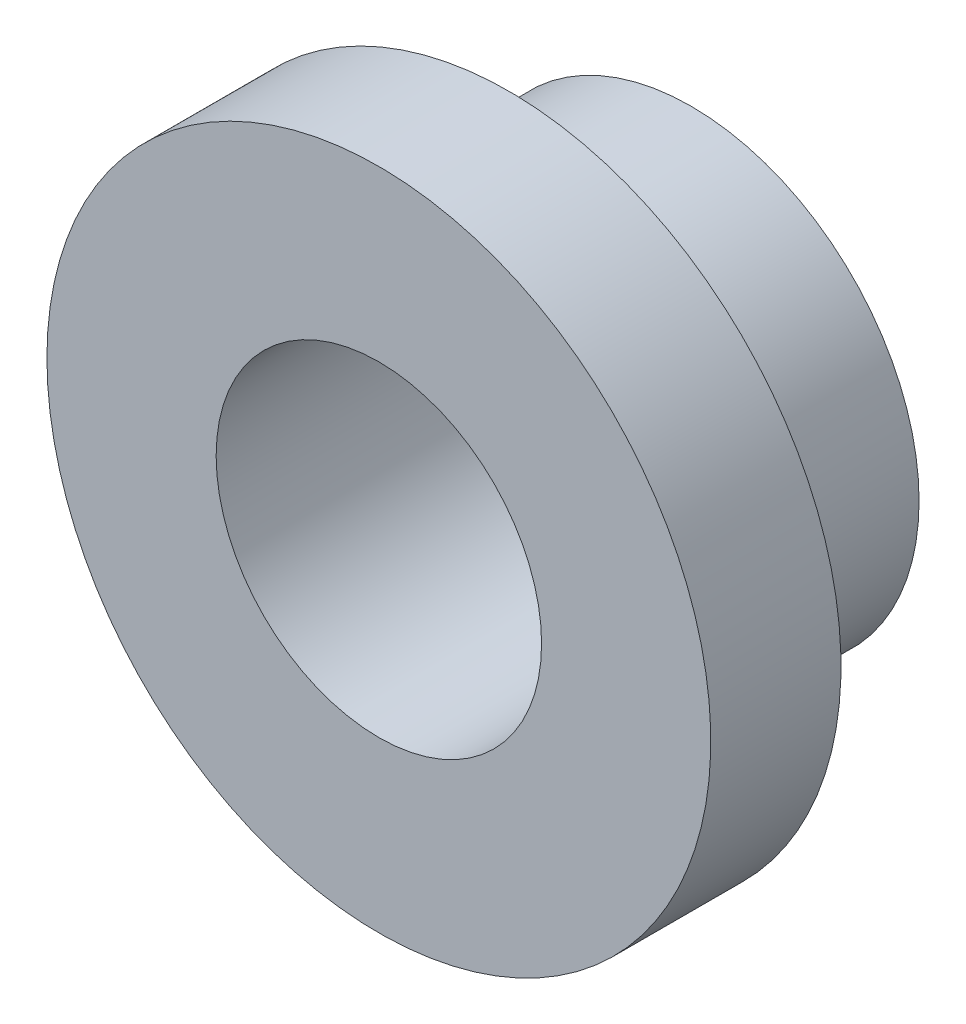
ISO-10303-21;
HEADER;
FILE_DESCRIPTION(('STEP AP214'),'2;1');
FILE_NAME('part.step','',(''),(''),'','','');
FILE_SCHEMA(('AUTOMOTIVE_DESIGN { 1 0 10303 214 1 1 1 1 }'));
ENDSEC;
DATA;
#1=APPLICATION_CONTEXT('core data for automotive mechanical design processes');
#2=APPLICATION_PROTOCOL_DEFINITION('international standard','automotive_design',2000,#1);
#3=PRODUCT_CONTEXT('',#1,'mechanical');
#4=PRODUCT('Part','Part','',(#3));
#5=PRODUCT_RELATED_PRODUCT_CATEGORY('part','',(#4));
#6=PRODUCT_DEFINITION_FORMATION('','',#4);
#7=PRODUCT_DEFINITION_CONTEXT('part definition',#1,'design');
#8=PRODUCT_DEFINITION('design','',#6,#7);
#9=PRODUCT_DEFINITION_SHAPE('','',#8);
#10=(LENGTH_UNIT() NAMED_UNIT(*) SI_UNIT(.MILLI.,.METRE.));
#11=(NAMED_UNIT(*) PLANE_ANGLE_UNIT() SI_UNIT($,.RADIAN.));
#12=(NAMED_UNIT(*) SI_UNIT($,.STERADIAN.) SOLID_ANGLE_UNIT());
#13=UNCERTAINTY_MEASURE_WITH_UNIT(LENGTH_MEASURE(1.E-05),#10,'distance_accuracy_value','');
#14=(GEOMETRIC_REPRESENTATION_CONTEXT(3) GLOBAL_UNCERTAINTY_ASSIGNED_CONTEXT((#13)) GLOBAL_UNIT_ASSIGNED_CONTEXT((#10,
#11,#12)) REPRESENTATION_CONTEXT('',''));
#15=CARTESIAN_POINT('',(0.,0.,0.));
#16=DIRECTION('',(0.,0.,1.));
#17=DIRECTION('',(1.,0.,0.));
#18=AXIS2_PLACEMENT_3D('',#15,#16,#17);
#19=CARTESIAN_POINT('',(0.,0.,-1.4));
#20=DIRECTION('',(0.,0.,-1.));
#21=DIRECTION('',(-1.,0.,0.));
#22=AXIS2_PLACEMENT_3D('',#19,#20,#21);
#23=PLANE('',#22);
#24=CARTESIAN_POINT('',(0.,0.,-1.4));
#25=DIRECTION('',(0.,0.,-1.));
#26=DIRECTION('',(-1.,0.,0.));
#27=AXIS2_PLACEMENT_3D('',#24,#25,#26);
#28=CIRCLE('',#27,1.25);
#29=CARTESIAN_POINT('',(-1.25,0.,-1.4));
#30=VERTEX_POINT('',#29);
#31=EDGE_CURVE('E93',#30,#30,#28,.F.);
#32=ORIENTED_EDGE('',*,*,#31,.T.);
#33=EDGE_LOOP('',(#32));
#34=FACE_BOUND('',#33,.T.);
#35=CARTESIAN_POINT('',(0.,0.,-1.4));
#36=DIRECTION('',(0.,0.,-1.));
#37=DIRECTION('',(-1.,0.,0.));
#38=AXIS2_PLACEMENT_3D('',#35,#36,#37);
#39=CIRCLE('',#38,1.75);
#40=CARTESIAN_POINT('',(-1.75,0.,-1.4));
#41=VERTEX_POINT('',#40);
#42=EDGE_CURVE('E11',#41,#41,#39,.T.);
#43=ORIENTED_EDGE('',*,*,#42,.T.);
#44=EDGE_LOOP('',(#43));
#45=FACE_BOUND('',#44,.T.);
#46=ADVANCED_FACE('F49',(#34,#45),#23,.T.);
#47=CARTESIAN_POINT('',(0.,0.,1.));
#48=DIRECTION('',(0.,0.,1.));
#49=DIRECTION('',(-1.,0.,0.));
#50=AXIS2_PLACEMENT_3D('',#47,#48,#49);
#51=CYLINDRICAL_SURFACE('',#50,1.75);
#52=CARTESIAN_POINT('',(0.,0.,0.));
#53=DIRECTION('',(0.,0.,-1.));
#54=DIRECTION('',(-1.,0.,0.));
#55=AXIS2_PLACEMENT_3D('',#52,#53,#54);
#56=CIRCLE('',#55,1.75);
#57=CARTESIAN_POINT('',(-1.75,0.,0.));
#58=VERTEX_POINT('',#57);
#59=EDGE_CURVE('E57',#58,#58,#56,.T.);
#60=ORIENTED_EDGE('',*,*,#59,.T.);
#61=EDGE_LOOP('',(#60));
#62=FACE_BOUND('',#61,.T.);
#63=ORIENTED_EDGE('',*,*,#42,.F.);
#64=EDGE_LOOP('',(#63));
#65=FACE_BOUND('',#64,.T.);
#66=ADVANCED_FACE('F127',(#62,#65),#51,.T.);
#67=CARTESIAN_POINT('',(-1.75,0.,0.));
#68=DIRECTION('',(0.,0.,-1.));
#69=DIRECTION('',(-1.,0.,0.));
#70=AXIS2_PLACEMENT_3D('',#67,#68,#69);
#71=PLANE('',#70);
#72=ORIENTED_EDGE('',*,*,#59,.F.);
#73=EDGE_LOOP('',(#72));
#74=FACE_BOUND('',#73,.T.);
#75=CARTESIAN_POINT('',(0.,0.,0.));
#76=DIRECTION('',(0.,0.,-1.));
#77=DIRECTION('',(-1.,0.,0.));
#78=AXIS2_PLACEMENT_3D('',#75,#76,#77);
#79=CIRCLE('',#78,2.55);
#80=CARTESIAN_POINT('',(-2.55,0.,0.));
#81=VERTEX_POINT('',#80);
#82=EDGE_CURVE('E86',#81,#81,#79,.T.);
#83=ORIENTED_EDGE('',*,*,#82,.T.);
#84=EDGE_LOOP('',(#83));
#85=FACE_BOUND('',#84,.T.);
#86=ADVANCED_FACE('F118',(#74,#85),#71,.T.);
#87=CARTESIAN_POINT('',(0.,0.,1.));
#88=DIRECTION('',(0.,0.,1.));
#89=DIRECTION('',(-1.,0.,0.));
#90=AXIS2_PLACEMENT_3D('',#87,#88,#89);
#91=CYLINDRICAL_SURFACE('',#90,2.55);
#92=CARTESIAN_POINT('',(0.,0.,1.));
#93=DIRECTION('',(0.,0.,-1.));
#94=DIRECTION('',(-1.,0.,0.));
#95=AXIS2_PLACEMENT_3D('',#92,#93,#94);
#96=CIRCLE('',#95,2.55);
#97=CARTESIAN_POINT('',(-2.55,0.,1.));
#98=VERTEX_POINT('',#97);
#99=EDGE_CURVE('E81',#98,#98,#96,.T.);
#100=ORIENTED_EDGE('',*,*,#99,.T.);
#101=EDGE_LOOP('',(#100));
#102=FACE_BOUND('',#101,.T.);
#103=ORIENTED_EDGE('',*,*,#82,.F.);
#104=EDGE_LOOP('',(#103));
#105=FACE_BOUND('',#104,.T.);
#106=ADVANCED_FACE('F82',(#102,#105),#91,.T.);
#107=CARTESIAN_POINT('',(-2.55,0.,1.));
#108=DIRECTION('',(0.,0.,1.));
#109=DIRECTION('',(1.,0.,0.));
#110=AXIS2_PLACEMENT_3D('',#107,#108,#109);
#111=PLANE('',#110);
#112=CARTESIAN_POINT('',(0.,0.,0.999999999999999));
#113=DIRECTION('',(0.,0.,1.));
#114=DIRECTION('',(1.,0.,0.));
#115=AXIS2_PLACEMENT_3D('',#112,#113,#114);
#116=CIRCLE('',#115,1.25);
#117=CARTESIAN_POINT('',(1.25,0.,0.999999999999999));
#118=VERTEX_POINT('',#117);
#119=EDGE_CURVE('E87',#118,#118,#116,.T.);
#120=ORIENTED_EDGE('',*,*,#119,.F.);
#121=EDGE_LOOP('',(#120));
#122=FACE_BOUND('',#121,.T.);
#123=ORIENTED_EDGE('',*,*,#99,.F.);
#124=EDGE_LOOP('',(#123));
#125=FACE_BOUND('',#124,.T.);
#126=ADVANCED_FACE('F101',(#122,#125),#111,.T.);
#127=CARTESIAN_POINT('',(0.,0.,-1.401));
#128=DIRECTION('',(0.,0.,1.));
#129=DIRECTION('',(1.,0.,0.));
#130=AXIS2_PLACEMENT_3D('',#127,#128,#129);
#131=CYLINDRICAL_SURFACE('',#130,1.25);
#132=ORIENTED_EDGE('',*,*,#31,.F.);
#133=EDGE_LOOP('',(#132));
#134=FACE_BOUND('',#133,.T.);
#135=ORIENTED_EDGE('',*,*,#119,.T.);
#136=EDGE_LOOP('',(#135));
#137=FACE_BOUND('',#136,.T.);
#138=ADVANCED_FACE('F107',(#134,#137),#131,.F.);
#139=CLOSED_SHELL('',(#46,#66,#86,#106,#126,#138));
#140=MANIFOLD_SOLID_BREP('B2',#139);
#141=ADVANCED_BREP_SHAPE_REPRESENTATION('',(#18,#140),#14);
#142=SHAPE_DEFINITION_REPRESENTATION(#9,#141);
ENDSEC;
END-ISO-10303-21;
